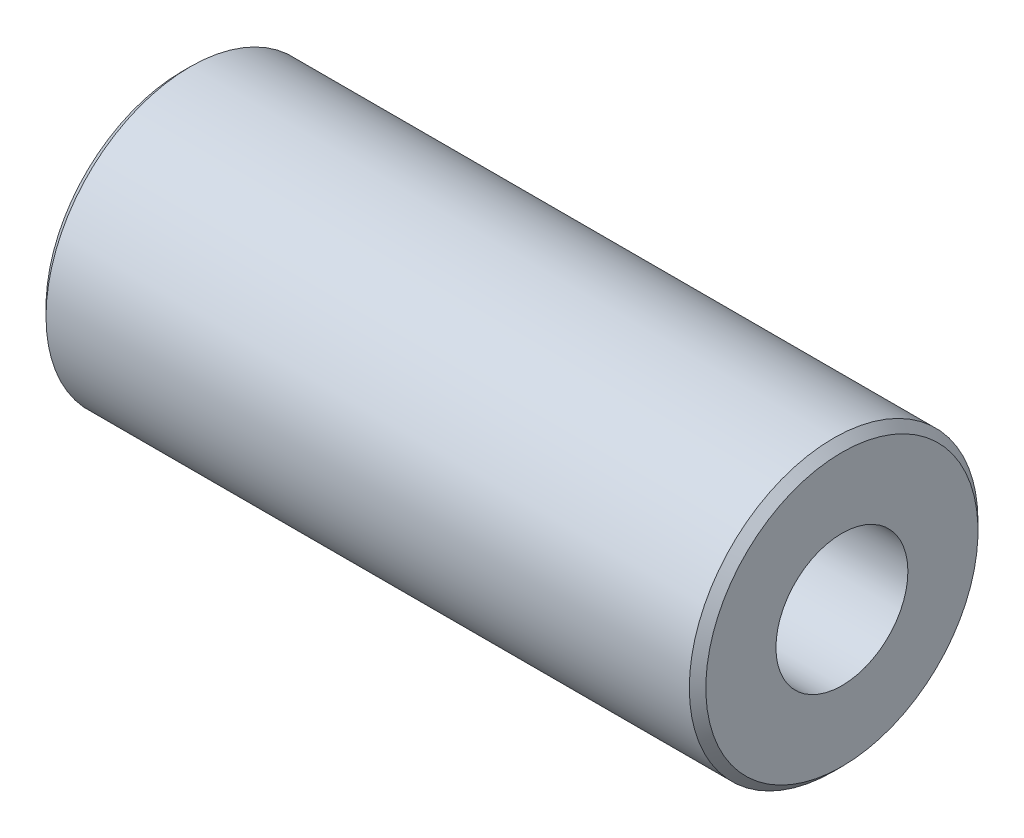
ISO-10303-21;
HEADER;
FILE_DESCRIPTION(('STEP AP214'),'2;1');
FILE_NAME('part.step','',(''),(''),'','','');
FILE_SCHEMA(('AUTOMOTIVE_DESIGN { 1 0 10303 214 1 1 1 1 }'));
ENDSEC;
DATA;
#1=APPLICATION_CONTEXT('core data for automotive mechanical design processes');
#2=APPLICATION_PROTOCOL_DEFINITION('international standard','automotive_design',2000,#1);
#3=PRODUCT_CONTEXT('',#1,'mechanical');
#4=PRODUCT('Part','Part','',(#3));
#5=PRODUCT_RELATED_PRODUCT_CATEGORY('part','',(#4));
#6=PRODUCT_DEFINITION_FORMATION('','',#4);
#7=PRODUCT_DEFINITION_CONTEXT('part definition',#1,'design');
#8=PRODUCT_DEFINITION('design','',#6,#7);
#9=PRODUCT_DEFINITION_SHAPE('','',#8);
#10=(LENGTH_UNIT() NAMED_UNIT(*) SI_UNIT(.MILLI.,.METRE.));
#11=(NAMED_UNIT(*) PLANE_ANGLE_UNIT() SI_UNIT($,.RADIAN.));
#12=(NAMED_UNIT(*) SI_UNIT($,.STERADIAN.) SOLID_ANGLE_UNIT());
#13=UNCERTAINTY_MEASURE_WITH_UNIT(LENGTH_MEASURE(1.E-05),#10,'distance_accuracy_value','');
#14=(GEOMETRIC_REPRESENTATION_CONTEXT(3) GLOBAL_UNCERTAINTY_ASSIGNED_CONTEXT((#13)) GLOBAL_UNIT_ASSIGNED_CONTEXT((#10,
#11,#12)) REPRESENTATION_CONTEXT('',''));
#15=CARTESIAN_POINT('',(0.,0.,0.));
#16=DIRECTION('',(0.,0.,1.));
#17=DIRECTION('',(1.,0.,0.));
#18=AXIS2_PLACEMENT_3D('',#15,#16,#17);
#19=CARTESIAN_POINT('',(4.,0.,0.));
#20=DIRECTION('',(-1.,0.,0.));
#21=DIRECTION('',(0.,-1.,0.));
#22=AXIS2_PLACEMENT_3D('',#19,#20,#21);
#23=PLANE('',#22);
#24=CARTESIAN_POINT('',(4.,0.,0.));
#25=DIRECTION('',(-1.,0.,0.));
#26=DIRECTION('',(0.,-1.,0.));
#27=AXIS2_PLACEMENT_3D('',#24,#25,#26);
#28=CIRCLE('',#27,1.65);
#29=CARTESIAN_POINT('',(4.,-1.65,0.));
#30=VERTEX_POINT('',#29);
#31=EDGE_CURVE('E49',#30,#30,#28,.F.);
#32=ORIENTED_EDGE('',*,*,#31,.T.);
#33=EDGE_LOOP('',(#32));
#34=FACE_BOUND('',#33,.T.);
#35=CARTESIAN_POINT('',(4.,0.,0.));
#36=DIRECTION('',(1.,0.,0.));
#37=DIRECTION('',(0.,0.,-1.));
#38=AXIS2_PLACEMENT_3D('',#35,#36,#37);
#39=CIRCLE('',#38,0.799999999999999);
#40=CARTESIAN_POINT('',(4.,0.,-0.799999999999999));
#41=VERTEX_POINT('',#40);
#42=EDGE_CURVE('E65',#41,#41,#39,.T.);
#43=ORIENTED_EDGE('',*,*,#42,.F.);
#44=EDGE_LOOP('',(#43));
#45=FACE_BOUND('',#44,.T.);
#46=ADVANCED_FACE('F41',(#34,#45),#23,.F.);
#47=CARTESIAN_POINT('',(-4.,0.,0.));
#48=DIRECTION('',(-1.,0.,0.));
#49=DIRECTION('',(0.,-1.,0.));
#50=AXIS2_PLACEMENT_3D('',#47,#48,#49);
#51=CYLINDRICAL_SURFACE('',#50,1.75);
#52=CARTESIAN_POINT('',(3.9,0.,0.));
#53=DIRECTION('',(-1.,0.,0.));
#54=DIRECTION('',(0.,-1.,0.));
#55=AXIS2_PLACEMENT_3D('',#52,#53,#54);
#56=CIRCLE('',#55,1.75);
#57=CARTESIAN_POINT('',(3.9,-1.75,0.));
#58=VERTEX_POINT('',#57);
#59=EDGE_CURVE('E53',#58,#58,#56,.T.);
#60=ORIENTED_EDGE('',*,*,#59,.T.);
#61=EDGE_LOOP('',(#60));
#62=FACE_BOUND('',#61,.T.);
#63=CARTESIAN_POINT('',(-3.9,0.,0.));
#64=DIRECTION('',(1.,0.,0.));
#65=DIRECTION('',(0.,1.,0.));
#66=AXIS2_PLACEMENT_3D('',#63,#64,#65);
#67=CIRCLE('',#66,1.75);
#68=CARTESIAN_POINT('',(-3.9,1.74999999999999,0.));
#69=VERTEX_POINT('',#68);
#70=EDGE_CURVE('E57',#69,#69,#67,.T.);
#71=ORIENTED_EDGE('',*,*,#70,.T.);
#72=EDGE_LOOP('',(#71));
#73=FACE_BOUND('',#72,.T.);
#74=ADVANCED_FACE('F72',(#62,#73),#51,.T.);
#75=CARTESIAN_POINT('',(-4.,1.74999999999999,0.));
#76=DIRECTION('',(1.,0.,0.));
#77=DIRECTION('',(0.,1.,0.));
#78=AXIS2_PLACEMENT_3D('',#75,#76,#77);
#79=PLANE('',#78);
#80=CARTESIAN_POINT('',(-4.,0.,0.));
#81=DIRECTION('',(1.,0.,0.));
#82=DIRECTION('',(0.,1.,0.));
#83=AXIS2_PLACEMENT_3D('',#80,#81,#82);
#84=CIRCLE('',#83,1.65);
#85=CARTESIAN_POINT('',(-4.,1.64999999999999,0.));
#86=VERTEX_POINT('',#85);
#87=EDGE_CURVE('E10',#86,#86,#84,.F.);
#88=ORIENTED_EDGE('',*,*,#87,.T.);
#89=EDGE_LOOP('',(#88));
#90=FACE_BOUND('',#89,.T.);
#91=CARTESIAN_POINT('',(-4.,0.,0.));
#92=DIRECTION('',(-1.,0.,0.));
#93=DIRECTION('',(0.,0.,1.));
#94=AXIS2_PLACEMENT_3D('',#91,#92,#93);
#95=CIRCLE('',#94,0.799999999999999);
#96=CARTESIAN_POINT('',(-4.,0.,0.799999999999999));
#97=VERTEX_POINT('',#96);
#98=EDGE_CURVE('E62',#97,#97,#95,.T.);
#99=ORIENTED_EDGE('',*,*,#98,.F.);
#100=EDGE_LOOP('',(#99));
#101=FACE_BOUND('',#100,.T.);
#102=ADVANCED_FACE('F77',(#90,#101),#79,.F.);
#103=CARTESIAN_POINT('',(-4.,0.,0.));
#104=DIRECTION('',(-1.,0.,0.));
#105=DIRECTION('',(0.,0.,1.));
#106=AXIS2_PLACEMENT_3D('',#103,#104,#105);
#107=CYLINDRICAL_SURFACE('',#106,0.799999999999998);
#108=ORIENTED_EDGE('',*,*,#98,.T.);
#109=EDGE_LOOP('',(#108));
#110=FACE_BOUND('',#109,.T.);
#111=ORIENTED_EDGE('',*,*,#42,.T.);
#112=EDGE_LOOP('',(#111));
#113=FACE_BOUND('',#112,.T.);
#114=ADVANCED_FACE('F69',(#110,#113),#107,.F.);
#115=CARTESIAN_POINT('',(3.9,0.,0.));
#116=DIRECTION('',(-1.,0.,0.));
#117=DIRECTION('',(0.,-1.,0.));
#118=AXIS2_PLACEMENT_3D('',#115,#116,#117);
#119=CONICAL_SURFACE('',#118,1.75,0.785398163397448);
#120=ORIENTED_EDGE('',*,*,#31,.F.);
#121=EDGE_LOOP('',(#120));
#122=FACE_BOUND('',#121,.T.);
#123=ORIENTED_EDGE('',*,*,#59,.F.);
#124=EDGE_LOOP('',(#123));
#125=FACE_BOUND('',#124,.T.);
#126=ADVANCED_FACE('F82',(#122,#125),#119,.T.);
#127=CARTESIAN_POINT('',(-4.,0.,0.));
#128=DIRECTION('',(1.,0.,0.));
#129=DIRECTION('',(0.,1.,0.));
#130=AXIS2_PLACEMENT_3D('',#127,#128,#129);
#131=CONICAL_SURFACE('',#130,1.65,0.785398163397443);
#132=ORIENTED_EDGE('',*,*,#70,.F.);
#133=EDGE_LOOP('',(#132));
#134=FACE_BOUND('',#133,.T.);
#135=ORIENTED_EDGE('',*,*,#87,.F.);
#136=EDGE_LOOP('',(#135));
#137=FACE_BOUND('',#136,.T.);
#138=ADVANCED_FACE('F44',(#134,#137),#131,.T.);
#139=CLOSED_SHELL('',(#46,#74,#102,#114,#126,#138));
#140=MANIFOLD_SOLID_BREP('B2',#139);
#141=ADVANCED_BREP_SHAPE_REPRESENTATION('',(#18,#140),#14);
#142=SHAPE_DEFINITION_REPRESENTATION(#9,#141);
ENDSEC;
END-ISO-10303-21;
